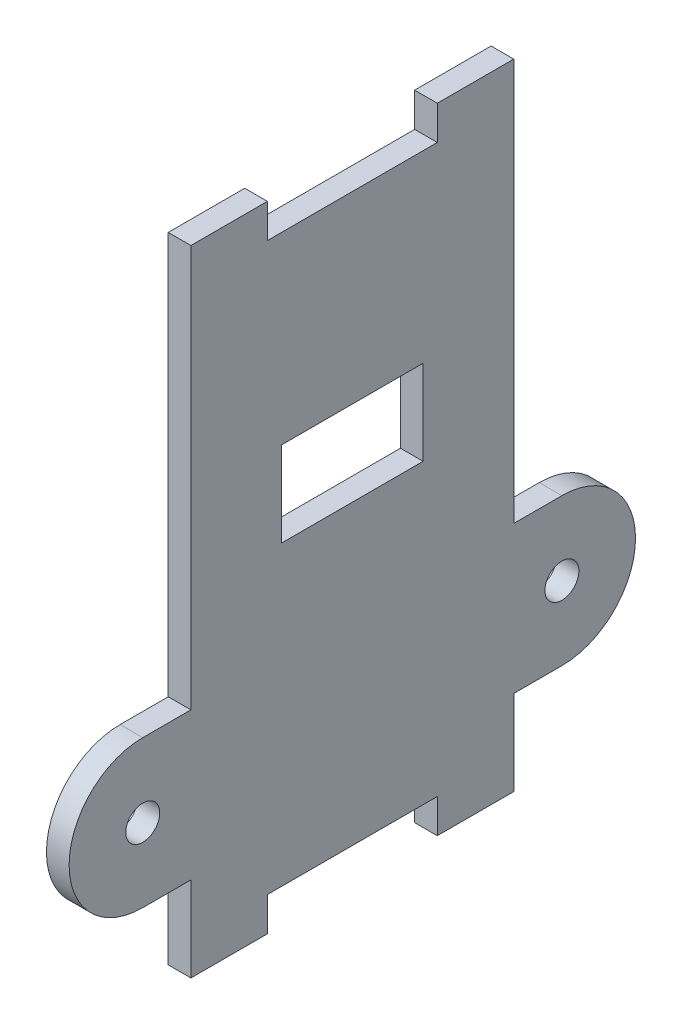
ISO-10303-21;
HEADER;
FILE_DESCRIPTION(('STEP AP214'),'2;1');
FILE_NAME('part.step','',(''),(''),'','','');
FILE_SCHEMA(('AUTOMOTIVE_DESIGN { 1 0 10303 214 1 1 1 1 }'));
ENDSEC;
DATA;
#1=APPLICATION_CONTEXT('core data for automotive mechanical design processes');
#2=APPLICATION_PROTOCOL_DEFINITION('international standard','automotive_design',2000,#1);
#3=PRODUCT_CONTEXT('',#1,'mechanical');
#4=PRODUCT('Part','Part','',(#3));
#5=PRODUCT_RELATED_PRODUCT_CATEGORY('part','',(#4));
#6=PRODUCT_DEFINITION_FORMATION('','',#4);
#7=PRODUCT_DEFINITION_CONTEXT('part definition',#1,'design');
#8=PRODUCT_DEFINITION('design','',#6,#7);
#9=PRODUCT_DEFINITION_SHAPE('','',#8);
#10=(LENGTH_UNIT() NAMED_UNIT(*) SI_UNIT(.MILLI.,.METRE.));
#11=(NAMED_UNIT(*) PLANE_ANGLE_UNIT() SI_UNIT($,.RADIAN.));
#12=(NAMED_UNIT(*) SI_UNIT($,.STERADIAN.) SOLID_ANGLE_UNIT());
#13=UNCERTAINTY_MEASURE_WITH_UNIT(LENGTH_MEASURE(1.E-05),#10,'distance_accuracy_value','');
#14=(GEOMETRIC_REPRESENTATION_CONTEXT(3) GLOBAL_UNCERTAINTY_ASSIGNED_CONTEXT((#13)) GLOBAL_UNIT_ASSIGNED_CONTEXT((#10,
#11,#12)) REPRESENTATION_CONTEXT('',''));
#15=CARTESIAN_POINT('',(0.,0.,0.));
#16=DIRECTION('',(0.,0.,1.));
#17=DIRECTION('',(1.,0.,0.));
#18=AXIS2_PLACEMENT_3D('',#15,#16,#17);
#19=CARTESIAN_POINT('',(0.,-14.,-18.5));
#20=DIRECTION('',(1.,0.,0.));
#21=DIRECTION('',(0.,0.,-1.));
#22=AXIS2_PLACEMENT_3D('',#19,#20,#21);
#23=PLANE('',#22);
#24=DIRECTION('',(0.,0.,-1.));
#25=VECTOR('',#24,1.);
#26=CARTESIAN_POINT('',(0.,8.75,6.25));
#27=LINE('',#26,#25);
#28=CARTESIAN_POINT('',(0.,8.75,6.25));
#29=VERTEX_POINT('',#28);
#30=CARTESIAN_POINT('',(0.,8.75,-6.25));
#31=VERTEX_POINT('',#30);
#32=EDGE_CURVE('E316',#29,#31,#27,.T.);
#33=ORIENTED_EDGE('',*,*,#32,.F.);
#34=DIRECTION('',(0.,1.,0.));
#35=VECTOR('',#34,1.);
#36=CARTESIAN_POINT('',(0.,1.25,6.25));
#37=LINE('',#36,#35);
#38=CARTESIAN_POINT('',(0.,1.25,6.25));
#39=VERTEX_POINT('',#38);
#40=EDGE_CURVE('E407',#39,#29,#37,.T.);
#41=ORIENTED_EDGE('',*,*,#40,.F.);
#42=DIRECTION('',(0.,0.,1.));
#43=VECTOR('',#42,1.);
#44=CARTESIAN_POINT('',(0.,1.25,6.25));
#45=LINE('',#44,#43);
#46=CARTESIAN_POINT('',(0.,1.25,-6.25));
#47=VERTEX_POINT('',#46);
#48=EDGE_CURVE('E413',#47,#39,#45,.T.);
#49=ORIENTED_EDGE('',*,*,#48,.F.);
#50=DIRECTION('',(0.,1.,0.));
#51=VECTOR('',#50,1.);
#52=CARTESIAN_POINT('',(0.,1.25,-6.25));
#53=LINE('',#52,#51);
#54=EDGE_CURVE('E418',#31,#47,#53,.F.);
#55=ORIENTED_EDGE('',*,*,#54,.F.);
#56=EDGE_LOOP('',(#33,#41,#49,#55));
#57=FACE_BOUND('',#56,.T.);
#58=CARTESIAN_POINT('',(0.,-14.,-18.5));
#59=DIRECTION('',(-1.,0.,0.));
#60=DIRECTION('',(0.,0.,1.));
#61=AXIS2_PLACEMENT_3D('',#58,#59,#60);
#62=CIRCLE('',#61,1.5);
#63=CARTESIAN_POINT('',(0.,-14.,-17.));
#64=VERTEX_POINT('',#63);
#65=EDGE_CURVE('E237',#64,#64,#62,.F.);
#66=ORIENTED_EDGE('',*,*,#65,.T.);
#67=EDGE_LOOP('',(#66));
#68=FACE_BOUND('',#67,.T.);
#69=DIRECTION('',(0.,-1.,0.));
#70=VECTOR('',#69,1.);
#71=CARTESIAN_POINT('',(0.,-25.,-14.25));
#72=LINE('',#71,#70);
#73=CARTESIAN_POINT('',(0.,-20.5,-14.25));
#74=VERTEX_POINT('',#73);
#75=CARTESIAN_POINT('',(0.,-28.,-14.25));
#76=VERTEX_POINT('',#75);
#77=EDGE_CURVE('E208',#74,#76,#72,.T.);
#78=ORIENTED_EDGE('',*,*,#77,.T.);
#79=DIRECTION('',(0.,0.,1.));
#80=VECTOR('',#79,1.);
#81=CARTESIAN_POINT('',(0.,-28.,-14.25));
#82=LINE('',#81,#80);
#83=CARTESIAN_POINT('',(0.,-28.,-7.5));
#84=VERTEX_POINT('',#83);
#85=EDGE_CURVE('E221',#76,#84,#82,.T.);
#86=ORIENTED_EDGE('',*,*,#85,.T.);
#87=DIRECTION('',(0.,1.,0.));
#88=VECTOR('',#87,1.);
#89=CARTESIAN_POINT('',(0.,-25.,-7.5));
#90=LINE('',#89,#88);
#91=CARTESIAN_POINT('',(0.,-25.,-7.5));
#92=VERTEX_POINT('',#91);
#93=EDGE_CURVE('E424',#84,#92,#90,.T.);
#94=ORIENTED_EDGE('',*,*,#93,.T.);
#95=DIRECTION('',(0.,0.,1.));
#96=VECTOR('',#95,1.);
#97=CARTESIAN_POINT('',(0.,-25.,0.));
#98=LINE('',#97,#96);
#99=CARTESIAN_POINT('',(0.,-25.,7.5));
#100=VERTEX_POINT('',#99);
#101=EDGE_CURVE('E429',#92,#100,#98,.T.);
#102=ORIENTED_EDGE('',*,*,#101,.T.);
#103=DIRECTION('',(0.,-1.,0.));
#104=VECTOR('',#103,1.);
#105=CARTESIAN_POINT('',(0.,-25.,7.5));
#106=LINE('',#105,#104);
#107=CARTESIAN_POINT('',(0.,-28.,7.5));
#108=VERTEX_POINT('',#107);
#109=EDGE_CURVE('E434',#100,#108,#106,.T.);
#110=ORIENTED_EDGE('',*,*,#109,.T.);
#111=DIRECTION('',(0.,0.,1.));
#112=VECTOR('',#111,1.);
#113=CARTESIAN_POINT('',(0.,-28.,14.25));
#114=LINE('',#113,#112);
#115=CARTESIAN_POINT('',(0.,-28.,14.25));
#116=VERTEX_POINT('',#115);
#117=EDGE_CURVE('E439',#108,#116,#114,.T.);
#118=ORIENTED_EDGE('',*,*,#117,.T.);
#119=DIRECTION('',(0.,1.,0.));
#120=VECTOR('',#119,1.);
#121=CARTESIAN_POINT('',(0.,-25.,14.25));
#122=LINE('',#121,#120);
#123=CARTESIAN_POINT('',(0.,-20.5,14.25));
#124=VERTEX_POINT('',#123);
#125=EDGE_CURVE('E247',#116,#124,#122,.T.);
#126=ORIENTED_EDGE('',*,*,#125,.T.);
#127=DIRECTION('',(0.,0.,1.));
#128=VECTOR('',#127,1.);
#129=CARTESIAN_POINT('',(0.,-20.5,18.5));
#130=LINE('',#129,#128);
#131=CARTESIAN_POINT('',(0.,-20.5,18.5));
#132=VERTEX_POINT('',#131);
#133=EDGE_CURVE('E240',#124,#132,#130,.T.);
#134=ORIENTED_EDGE('',*,*,#133,.T.);
#135=CARTESIAN_POINT('',(0.,-14.,18.5));
#136=DIRECTION('',(-1.,0.,0.));
#137=DIRECTION('',(0.,0.,1.));
#138=AXIS2_PLACEMENT_3D('',#135,#136,#137);
#139=CIRCLE('',#138,6.5);
#140=CARTESIAN_POINT('',(0.,-7.50000000000001,18.5));
#141=VERTEX_POINT('',#140);
#142=EDGE_CURVE('E317',#141,#132,#139,.F.);
#143=ORIENTED_EDGE('',*,*,#142,.F.);
#144=DIRECTION('',(0.,0.,-1.));
#145=VECTOR('',#144,1.);
#146=CARTESIAN_POINT('',(0.,-7.50000000000001,18.5));
#147=LINE('',#146,#145);
#148=CARTESIAN_POINT('',(0.,-7.50000000000001,14.25));
#149=VERTEX_POINT('',#148);
#150=EDGE_CURVE('E253',#141,#149,#147,.T.);
#151=ORIENTED_EDGE('',*,*,#150,.T.);
#152=DIRECTION('',(0.,1.,0.));
#153=VECTOR('',#152,1.);
#154=CARTESIAN_POINT('',(0.,-7.50000000000001,14.25));
#155=LINE('',#154,#153);
#156=CARTESIAN_POINT('',(0.,28.,14.25));
#157=VERTEX_POINT('',#156);
#158=EDGE_CURVE('E260',#149,#157,#155,.T.);
#159=ORIENTED_EDGE('',*,*,#158,.T.);
#160=DIRECTION('',(0.,0.,-1.));
#161=VECTOR('',#160,1.);
#162=CARTESIAN_POINT('',(0.,28.,14.25));
#163=LINE('',#162,#161);
#164=CARTESIAN_POINT('',(0.,28.,7.5));
#165=VERTEX_POINT('',#164);
#166=EDGE_CURVE('E266',#157,#165,#163,.T.);
#167=ORIENTED_EDGE('',*,*,#166,.T.);
#168=DIRECTION('',(0.,1.,0.));
#169=VECTOR('',#168,1.);
#170=CARTESIAN_POINT('',(0.,25.,7.5));
#171=LINE('',#170,#169);
#172=CARTESIAN_POINT('',(0.,25.,7.5));
#173=VERTEX_POINT('',#172);
#174=EDGE_CURVE('E272',#165,#173,#171,.F.);
#175=ORIENTED_EDGE('',*,*,#174,.T.);
#176=DIRECTION('',(0.,0.,-1.));
#177=VECTOR('',#176,1.);
#178=CARTESIAN_POINT('',(0.,25.,0.));
#179=LINE('',#178,#177);
#180=CARTESIAN_POINT('',(0.,25.,-7.5));
#181=VERTEX_POINT('',#180);
#182=EDGE_CURVE('E278',#173,#181,#179,.T.);
#183=ORIENTED_EDGE('',*,*,#182,.T.);
#184=DIRECTION('',(0.,1.,0.));
#185=VECTOR('',#184,1.);
#186=CARTESIAN_POINT('',(0.,25.,-7.5));
#187=LINE('',#186,#185);
#188=CARTESIAN_POINT('',(0.,28.,-7.5));
#189=VERTEX_POINT('',#188);
#190=EDGE_CURVE('E284',#181,#189,#187,.T.);
#191=ORIENTED_EDGE('',*,*,#190,.T.);
#192=DIRECTION('',(0.,0.,-1.));
#193=VECTOR('',#192,1.);
#194=CARTESIAN_POINT('',(0.,28.,-14.25));
#195=LINE('',#194,#193);
#196=CARTESIAN_POINT('',(0.,28.,-14.25));
#197=VERTEX_POINT('',#196);
#198=EDGE_CURVE('E290',#189,#197,#195,.T.);
#199=ORIENTED_EDGE('',*,*,#198,.T.);
#200=DIRECTION('',(0.,1.,0.));
#201=VECTOR('',#200,1.);
#202=CARTESIAN_POINT('',(0.,25.,-14.25));
#203=LINE('',#202,#201);
#204=CARTESIAN_POINT('',(0.,-7.5,-14.25));
#205=VERTEX_POINT('',#204);
#206=EDGE_CURVE('E191',#197,#205,#203,.F.);
#207=ORIENTED_EDGE('',*,*,#206,.T.);
#208=DIRECTION('',(0.,0.,-1.));
#209=VECTOR('',#208,1.);
#210=CARTESIAN_POINT('',(0.,-7.5,-18.5));
#211=LINE('',#210,#209);
#212=CARTESIAN_POINT('',(0.,-7.5,-18.5));
#213=VERTEX_POINT('',#212);
#214=EDGE_CURVE('E188',#205,#213,#211,.T.);
#215=ORIENTED_EDGE('',*,*,#214,.T.);
#216=CARTESIAN_POINT('',(0.,-14.,-18.5));
#217=DIRECTION('',(-1.,0.,0.));
#218=DIRECTION('',(0.,0.,1.));
#219=AXIS2_PLACEMENT_3D('',#216,#217,#218);
#220=CIRCLE('',#219,6.5);
#221=CARTESIAN_POINT('',(0.,-20.5,-18.5));
#222=VERTEX_POINT('',#221);
#223=EDGE_CURVE('E176',#222,#213,#220,.F.);
#224=ORIENTED_EDGE('',*,*,#223,.F.);
#225=DIRECTION('',(0.,0.,1.));
#226=VECTOR('',#225,1.);
#227=CARTESIAN_POINT('',(0.,-20.5,-14.25));
#228=LINE('',#227,#226);
#229=EDGE_CURVE('E186',#222,#74,#228,.T.);
#230=ORIENTED_EDGE('',*,*,#229,.T.);
#231=EDGE_LOOP('',(#78,#86,#94,#102,#110,#118,#126,#134,#143,#151,#159,#167,#175,#183,#191,#199,
#207,#215,#224,#230));
#232=FACE_BOUND('',#231,.T.);
#233=CARTESIAN_POINT('',(0.,-14.,18.5));
#234=DIRECTION('',(-1.,0.,0.));
#235=DIRECTION('',(0.,0.,1.));
#236=AXIS2_PLACEMENT_3D('',#233,#234,#235);
#237=CIRCLE('',#236,1.5);
#238=CARTESIAN_POINT('',(0.,-14.,20.));
#239=VERTEX_POINT('',#238);
#240=EDGE_CURVE('E19',#239,#239,#237,.F.);
#241=ORIENTED_EDGE('',*,*,#240,.T.);
#242=EDGE_LOOP('',(#241));
#243=FACE_BOUND('',#242,.T.);
#244=ADVANCED_FACE('F16',(#57,#68,#232,#243),#23,.F.);
#245=CARTESIAN_POINT('',(2.,-14.,18.5));
#246=DIRECTION('',(-1.,0.,0.));
#247=DIRECTION('',(0.,0.,1.));
#248=AXIS2_PLACEMENT_3D('',#245,#246,#247);
#249=CYLINDRICAL_SURFACE('',#248,1.5);
#250=CARTESIAN_POINT('',(2.,-14.,18.5));
#251=DIRECTION('',(-1.,0.,0.));
#252=DIRECTION('',(0.,0.,1.));
#253=AXIS2_PLACEMENT_3D('',#250,#251,#252);
#254=CIRCLE('',#253,1.5);
#255=CARTESIAN_POINT('',(2.,-14.,20.));
#256=VERTEX_POINT('',#255);
#257=EDGE_CURVE('E215',#256,#256,#254,.T.);
#258=ORIENTED_EDGE('',*,*,#257,.F.);
#259=EDGE_LOOP('',(#258));
#260=FACE_BOUND('',#259,.T.);
#261=ORIENTED_EDGE('',*,*,#240,.F.);
#262=EDGE_LOOP('',(#261));
#263=FACE_BOUND('',#262,.T.);
#264=ADVANCED_FACE('F713',(#260,#263),#249,.F.);
#265=CARTESIAN_POINT('',(2.,-25.,-14.25));
#266=DIRECTION('',(0.,0.,1.));
#267=DIRECTION('',(0.,-1.,0.));
#268=AXIS2_PLACEMENT_3D('',#265,#266,#267);
#269=PLANE('',#268);
#270=DIRECTION('',(1.,0.,0.));
#271=VECTOR('',#270,1.);
#272=CARTESIAN_POINT('',(2.,-20.5,-14.25));
#273=LINE('',#272,#271);
#274=CARTESIAN_POINT('',(2.,-20.5,-14.25));
#275=VERTEX_POINT('',#274);
#276=EDGE_CURVE('E206',#74,#275,#273,.T.);
#277=ORIENTED_EDGE('',*,*,#276,.T.);
#278=DIRECTION('',(0.,1.,0.));
#279=VECTOR('',#278,1.);
#280=CARTESIAN_POINT('',(2.,-14.,-14.25));
#281=LINE('',#280,#279);
#282=CARTESIAN_POINT('',(2.,-28.,-14.25));
#283=VERTEX_POINT('',#282);
#284=EDGE_CURVE('E211',#283,#275,#281,.T.);
#285=ORIENTED_EDGE('',*,*,#284,.F.);
#286=DIRECTION('',(1.,0.,0.));
#287=VECTOR('',#286,1.);
#288=CARTESIAN_POINT('',(2.,-28.,-14.25));
#289=LINE('',#288,#287);
#290=EDGE_CURVE('E218',#283,#76,#289,.F.);
#291=ORIENTED_EDGE('',*,*,#290,.T.);
#292=ORIENTED_EDGE('',*,*,#77,.F.);
#293=EDGE_LOOP('',(#277,#285,#291,#292));
#294=FACE_BOUND('',#293,.T.);
#295=ADVANCED_FACE('F704',(#294),#269,.F.);
#296=CARTESIAN_POINT('',(2.,-20.5,-14.25));
#297=DIRECTION('',(0.,1.,0.));
#298=DIRECTION('',(0.,0.,1.));
#299=AXIS2_PLACEMENT_3D('',#296,#297,#298);
#300=PLANE('',#299);
#301=DIRECTION('',(-1.,0.,0.));
#302=VECTOR('',#301,1.);
#303=CARTESIAN_POINT('',(2.,-20.5,-18.5));
#304=LINE('',#303,#302);
#305=CARTESIAN_POINT('',(2.,-20.5,-18.5));
#306=VERTEX_POINT('',#305);
#307=EDGE_CURVE('E185',#306,#222,#304,.T.);
#308=ORIENTED_EDGE('',*,*,#307,.F.);
#309=DIRECTION('',(0.,0.,-1.));
#310=VECTOR('',#309,1.);
#311=CARTESIAN_POINT('',(2.,-20.5,-18.5));
#312=LINE('',#311,#310);
#313=EDGE_CURVE('E214',#275,#306,#312,.T.);
#314=ORIENTED_EDGE('',*,*,#313,.F.);
#315=ORIENTED_EDGE('',*,*,#276,.F.);
#316=ORIENTED_EDGE('',*,*,#229,.F.);
#317=EDGE_LOOP('',(#308,#314,#315,#316));
#318=FACE_BOUND('',#317,.T.);
#319=ADVANCED_FACE('F696',(#318),#300,.F.);
#320=CARTESIAN_POINT('',(2.,-14.,-18.5));
#321=DIRECTION('',(-1.,0.,0.));
#322=DIRECTION('',(0.,0.,1.));
#323=AXIS2_PLACEMENT_3D('',#320,#321,#322);
#324=CYLINDRICAL_SURFACE('',#323,6.5);
#325=CARTESIAN_POINT('',(2.,-14.,-18.5));
#326=DIRECTION('',(-1.,0.,0.));
#327=DIRECTION('',(0.,0.,1.));
#328=AXIS2_PLACEMENT_3D('',#325,#326,#327);
#329=CIRCLE('',#328,6.5);
#330=CARTESIAN_POINT('',(2.,-7.5,-18.5));
#331=VERTEX_POINT('',#330);
#332=EDGE_CURVE('E310',#306,#331,#329,.F.);
#333=ORIENTED_EDGE('',*,*,#332,.F.);
#334=ORIENTED_EDGE('',*,*,#307,.T.);
#335=ORIENTED_EDGE('',*,*,#223,.T.);
#336=DIRECTION('',(1.,0.,0.));
#337=VECTOR('',#336,1.);
#338=CARTESIAN_POINT('',(2.,-7.5,-18.5));
#339=LINE('',#338,#337);
#340=EDGE_CURVE('E183',#213,#331,#339,.T.);
#341=ORIENTED_EDGE('',*,*,#340,.T.);
#342=EDGE_LOOP('',(#333,#334,#335,#341));
#343=FACE_BOUND('',#342,.T.);
#344=ADVANCED_FACE('F181',(#343),#324,.T.);
#345=CARTESIAN_POINT('',(2.,-7.5,-18.5));
#346=DIRECTION('',(0.,-1.,0.));
#347=DIRECTION('',(0.,0.,-1.));
#348=AXIS2_PLACEMENT_3D('',#345,#346,#347);
#349=PLANE('',#348);
#350=DIRECTION('',(1.,0.,0.));
#351=VECTOR('',#350,1.);
#352=CARTESIAN_POINT('',(2.,-7.5,-14.25));
#353=LINE('',#352,#351);
#354=CARTESIAN_POINT('',(2.,-7.5,-14.25));
#355=VERTEX_POINT('',#354);
#356=EDGE_CURVE('E194',#205,#355,#353,.T.);
#357=ORIENTED_EDGE('',*,*,#356,.T.);
#358=DIRECTION('',(0.,0.,-1.));
#359=VECTOR('',#358,1.);
#360=CARTESIAN_POINT('',(2.,-7.5,-18.5));
#361=LINE('',#360,#359);
#362=EDGE_CURVE('E198',#331,#355,#361,.F.);
#363=ORIENTED_EDGE('',*,*,#362,.F.);
#364=ORIENTED_EDGE('',*,*,#340,.F.);
#365=ORIENTED_EDGE('',*,*,#214,.F.);
#366=EDGE_LOOP('',(#357,#363,#364,#365));
#367=FACE_BOUND('',#366,.T.);
#368=ADVANCED_FACE('F196',(#367),#349,.F.);
#369=CARTESIAN_POINT('',(2.,25.,-14.25));
#370=DIRECTION('',(0.,0.,1.));
#371=DIRECTION('',(1.,0.,0.));
#372=AXIS2_PLACEMENT_3D('',#369,#370,#371);
#373=PLANE('',#372);
#374=DIRECTION('',(1.,0.,0.));
#375=VECTOR('',#374,1.);
#376=CARTESIAN_POINT('',(2.,28.,-14.25));
#377=LINE('',#376,#375);
#378=CARTESIAN_POINT('',(2.,28.,-14.25));
#379=VERTEX_POINT('',#378);
#380=EDGE_CURVE('E292',#197,#379,#377,.T.);
#381=ORIENTED_EDGE('',*,*,#380,.T.);
#382=DIRECTION('',(0.,1.,0.));
#383=VECTOR('',#382,1.);
#384=CARTESIAN_POINT('',(2.,-14.,-14.25));
#385=LINE('',#384,#383);
#386=EDGE_CURVE('E374',#355,#379,#385,.T.);
#387=ORIENTED_EDGE('',*,*,#386,.F.);
#388=ORIENTED_EDGE('',*,*,#356,.F.);
#389=ORIENTED_EDGE('',*,*,#206,.F.);
#390=EDGE_LOOP('',(#381,#387,#388,#389));
#391=FACE_BOUND('',#390,.T.);
#392=ADVANCED_FACE('F385',(#391),#373,.F.);
#393=CARTESIAN_POINT('',(2.,28.,-14.25));
#394=DIRECTION('',(0.,-1.,0.));
#395=DIRECTION('',(0.,0.,-1.));
#396=AXIS2_PLACEMENT_3D('',#393,#394,#395);
#397=PLANE('',#396);
#398=DIRECTION('',(-1.,0.,0.));
#399=VECTOR('',#398,1.);
#400=CARTESIAN_POINT('',(2.,28.,-7.5));
#401=LINE('',#400,#399);
#402=CARTESIAN_POINT('',(2.,28.,-7.5));
#403=VERTEX_POINT('',#402);
#404=EDGE_CURVE('E287',#189,#403,#401,.F.);
#405=ORIENTED_EDGE('',*,*,#404,.T.);
#406=DIRECTION('',(0.,0.,-1.));
#407=VECTOR('',#406,1.);
#408=CARTESIAN_POINT('',(2.,28.,-18.5));
#409=LINE('',#408,#407);
#410=EDGE_CURVE('E366',#379,#403,#409,.F.);
#411=ORIENTED_EDGE('',*,*,#410,.F.);
#412=ORIENTED_EDGE('',*,*,#380,.F.);
#413=ORIENTED_EDGE('',*,*,#198,.F.);
#414=EDGE_LOOP('',(#405,#411,#412,#413));
#415=FACE_BOUND('',#414,.T.);
#416=ADVANCED_FACE('F665',(#415),#397,.F.);
#417=CARTESIAN_POINT('',(2.,25.,-7.5));
#418=DIRECTION('',(0.,0.,-1.));
#419=DIRECTION('',(-1.,0.,0.));
#420=AXIS2_PLACEMENT_3D('',#417,#418,#419);
#421=PLANE('',#420);
#422=DIRECTION('',(1.,0.,0.));
#423=VECTOR('',#422,1.);
#424=CARTESIAN_POINT('',(2.,25.,-7.50000000000001));
#425=LINE('',#424,#423);
#426=CARTESIAN_POINT('',(2.,25.,-7.5));
#427=VERTEX_POINT('',#426);
#428=EDGE_CURVE('E281',#181,#427,#425,.T.);
#429=ORIENTED_EDGE('',*,*,#428,.T.);
#430=DIRECTION('',(0.,1.,0.));
#431=VECTOR('',#430,1.);
#432=CARTESIAN_POINT('',(2.,-14.,-7.5));
#433=LINE('',#432,#431);
#434=EDGE_CURVE('E358',#403,#427,#433,.F.);
#435=ORIENTED_EDGE('',*,*,#434,.F.);
#436=ORIENTED_EDGE('',*,*,#404,.F.);
#437=ORIENTED_EDGE('',*,*,#190,.F.);
#438=EDGE_LOOP('',(#429,#435,#436,#437));
#439=FACE_BOUND('',#438,.T.);
#440=ADVANCED_FACE('F656',(#439),#421,.F.);
#441=CARTESIAN_POINT('',(2.,25.,0.));
#442=DIRECTION('',(0.,-1.,0.));
#443=DIRECTION('',(0.,0.,-1.));
#444=AXIS2_PLACEMENT_3D('',#441,#442,#443);
#445=PLANE('',#444);
#446=DIRECTION('',(1.,0.,0.));
#447=VECTOR('',#446,1.);
#448=CARTESIAN_POINT('',(2.,25.,7.5));
#449=LINE('',#448,#447);
#450=CARTESIAN_POINT('',(2.,25.,7.5));
#451=VERTEX_POINT('',#450);
#452=EDGE_CURVE('E275',#173,#451,#449,.T.);
#453=ORIENTED_EDGE('',*,*,#452,.T.);
#454=DIRECTION('',(0.,0.,-1.));
#455=VECTOR('',#454,1.);
#456=CARTESIAN_POINT('',(2.,25.,-18.5));
#457=LINE('',#456,#455);
#458=EDGE_CURVE('E350',#427,#451,#457,.F.);
#459=ORIENTED_EDGE('',*,*,#458,.F.);
#460=ORIENTED_EDGE('',*,*,#428,.F.);
#461=ORIENTED_EDGE('',*,*,#182,.F.);
#462=EDGE_LOOP('',(#453,#459,#460,#461));
#463=FACE_BOUND('',#462,.T.);
#464=ADVANCED_FACE('F647',(#463),#445,.F.);
#465=CARTESIAN_POINT('',(2.,25.,7.5));
#466=DIRECTION('',(0.,0.,1.));
#467=DIRECTION('',(1.,0.,0.));
#468=AXIS2_PLACEMENT_3D('',#465,#466,#467);
#469=PLANE('',#468);
#470=DIRECTION('',(1.,0.,0.));
#471=VECTOR('',#470,1.);
#472=CARTESIAN_POINT('',(2.,28.,7.5));
#473=LINE('',#472,#471);
#474=CARTESIAN_POINT('',(2.,28.,7.5));
#475=VERTEX_POINT('',#474);
#476=EDGE_CURVE('E269',#165,#475,#473,.T.);
#477=ORIENTED_EDGE('',*,*,#476,.T.);
#478=DIRECTION('',(0.,1.,0.));
#479=VECTOR('',#478,1.);
#480=CARTESIAN_POINT('',(2.,-14.,7.5));
#481=LINE('',#480,#479);
#482=EDGE_CURVE('E342',#451,#475,#481,.T.);
#483=ORIENTED_EDGE('',*,*,#482,.F.);
#484=ORIENTED_EDGE('',*,*,#452,.F.);
#485=ORIENTED_EDGE('',*,*,#174,.F.);
#486=EDGE_LOOP('',(#477,#483,#484,#485));
#487=FACE_BOUND('',#486,.T.);
#488=ADVANCED_FACE('F638',(#487),#469,.F.);
#489=CARTESIAN_POINT('',(2.,28.,14.25));
#490=DIRECTION('',(0.,-1.,0.));
#491=DIRECTION('',(0.,0.,-1.));
#492=AXIS2_PLACEMENT_3D('',#489,#490,#491);
#493=PLANE('',#492);
#494=DIRECTION('',(1.,0.,0.));
#495=VECTOR('',#494,1.);
#496=CARTESIAN_POINT('',(2.,28.,14.25));
#497=LINE('',#496,#495);
#498=CARTESIAN_POINT('',(2.,28.,14.25));
#499=VERTEX_POINT('',#498);
#500=EDGE_CURVE('E263',#157,#499,#497,.T.);
#501=ORIENTED_EDGE('',*,*,#500,.T.);
#502=DIRECTION('',(0.,0.,-1.));
#503=VECTOR('',#502,1.);
#504=CARTESIAN_POINT('',(2.,28.,-18.5));
#505=LINE('',#504,#503);
#506=EDGE_CURVE('E334',#475,#499,#505,.F.);
#507=ORIENTED_EDGE('',*,*,#506,.F.);
#508=ORIENTED_EDGE('',*,*,#476,.F.);
#509=ORIENTED_EDGE('',*,*,#166,.F.);
#510=EDGE_LOOP('',(#501,#507,#508,#509));
#511=FACE_BOUND('',#510,.T.);
#512=ADVANCED_FACE('F629',(#511),#493,.F.);
#513=CARTESIAN_POINT('',(2.,-7.50000000000001,14.25));
#514=DIRECTION('',(0.,0.,-1.));
#515=DIRECTION('',(0.,1.,0.));
#516=AXIS2_PLACEMENT_3D('',#513,#514,#515);
#517=PLANE('',#516);
#518=DIRECTION('',(1.,0.,0.));
#519=VECTOR('',#518,1.);
#520=CARTESIAN_POINT('',(2.,-7.50000000000001,14.25));
#521=LINE('',#520,#519);
#522=CARTESIAN_POINT('',(2.,-7.50000000000001,14.25));
#523=VERTEX_POINT('',#522);
#524=EDGE_CURVE('E257',#149,#523,#521,.T.);
#525=ORIENTED_EDGE('',*,*,#524,.T.);
#526=DIRECTION('',(0.,1.,0.));
#527=VECTOR('',#526,1.);
#528=CARTESIAN_POINT('',(2.,-14.,14.25));
#529=LINE('',#528,#527);
#530=EDGE_CURVE('E331',#499,#523,#529,.F.);
#531=ORIENTED_EDGE('',*,*,#530,.F.);
#532=ORIENTED_EDGE('',*,*,#500,.F.);
#533=ORIENTED_EDGE('',*,*,#158,.F.);
#534=EDGE_LOOP('',(#525,#531,#532,#533));
#535=FACE_BOUND('',#534,.T.);
#536=ADVANCED_FACE('F481',(#535),#517,.F.);
#537=CARTESIAN_POINT('',(2.,-7.50000000000001,18.5));
#538=DIRECTION('',(0.,-1.,0.));
#539=DIRECTION('',(0.,0.,-1.));
#540=AXIS2_PLACEMENT_3D('',#537,#538,#539);
#541=PLANE('',#540);
#542=DIRECTION('',(-1.,0.,0.));
#543=VECTOR('',#542,1.);
#544=CARTESIAN_POINT('',(2.,-7.50000000000001,18.5));
#545=LINE('',#544,#543);
#546=CARTESIAN_POINT('',(2.,-7.50000000000001,18.5));
#547=VERTEX_POINT('',#546);
#548=EDGE_CURVE('E256',#547,#141,#545,.T.);
#549=ORIENTED_EDGE('',*,*,#548,.F.);
#550=DIRECTION('',(0.,0.,-1.));
#551=VECTOR('',#550,1.);
#552=CARTESIAN_POINT('',(2.,-7.50000000000001,-18.5));
#553=LINE('',#552,#551);
#554=EDGE_CURVE('E309',#523,#547,#553,.F.);
#555=ORIENTED_EDGE('',*,*,#554,.F.);
#556=ORIENTED_EDGE('',*,*,#524,.F.);
#557=ORIENTED_EDGE('',*,*,#150,.F.);
#558=EDGE_LOOP('',(#549,#555,#556,#557));
#559=FACE_BOUND('',#558,.T.);
#560=ADVANCED_FACE('F470',(#559),#541,.F.);
#561=CARTESIAN_POINT('',(2.,-14.,18.5));
#562=DIRECTION('',(-1.,0.,0.));
#563=DIRECTION('',(0.,0.,1.));
#564=AXIS2_PLACEMENT_3D('',#561,#562,#563);
#565=CYLINDRICAL_SURFACE('',#564,6.5);
#566=ORIENTED_EDGE('',*,*,#142,.T.);
#567=DIRECTION('',(1.,0.,0.));
#568=VECTOR('',#567,1.);
#569=CARTESIAN_POINT('',(2.,-20.5,18.5));
#570=LINE('',#569,#568);
#571=CARTESIAN_POINT('',(2.,-20.5,18.5));
#572=VERTEX_POINT('',#571);
#573=EDGE_CURVE('E244',#132,#572,#570,.T.);
#574=ORIENTED_EDGE('',*,*,#573,.T.);
#575=CARTESIAN_POINT('',(2.,-14.,18.5));
#576=DIRECTION('',(-1.,0.,0.));
#577=DIRECTION('',(0.,0.,1.));
#578=AXIS2_PLACEMENT_3D('',#575,#576,#577);
#579=CIRCLE('',#578,6.5);
#580=EDGE_CURVE('E306',#547,#572,#579,.F.);
#581=ORIENTED_EDGE('',*,*,#580,.F.);
#582=ORIENTED_EDGE('',*,*,#548,.T.);
#583=EDGE_LOOP('',(#566,#574,#581,#582));
#584=FACE_BOUND('',#583,.T.);
#585=ADVANCED_FACE('F472',(#584),#565,.T.);
#586=CARTESIAN_POINT('',(2.,-20.5,18.5));
#587=DIRECTION('',(0.,1.,0.));
#588=DIRECTION('',(0.,0.,1.));
#589=AXIS2_PLACEMENT_3D('',#586,#587,#588);
#590=PLANE('',#589);
#591=DIRECTION('',(1.,0.,0.));
#592=VECTOR('',#591,1.);
#593=CARTESIAN_POINT('',(2.,-20.5,14.25));
#594=LINE('',#593,#592);
#595=CARTESIAN_POINT('',(2.,-20.5,14.25));
#596=VERTEX_POINT('',#595);
#597=EDGE_CURVE('E243',#124,#596,#594,.T.);
#598=ORIENTED_EDGE('',*,*,#597,.T.);
#599=DIRECTION('',(0.,0.,-1.));
#600=VECTOR('',#599,1.);
#601=CARTESIAN_POINT('',(2.,-20.5,-18.5));
#602=LINE('',#601,#600);
#603=EDGE_CURVE('E308',#572,#596,#602,.T.);
#604=ORIENTED_EDGE('',*,*,#603,.F.);
#605=ORIENTED_EDGE('',*,*,#573,.F.);
#606=ORIENTED_EDGE('',*,*,#133,.F.);
#607=EDGE_LOOP('',(#598,#604,#605,#606));
#608=FACE_BOUND('',#607,.T.);
#609=ADVANCED_FACE('F452',(#608),#590,.F.);
#610=CARTESIAN_POINT('',(2.,-25.,14.25));
#611=DIRECTION('',(0.,0.,-1.));
#612=DIRECTION('',(0.,1.,0.));
#613=AXIS2_PLACEMENT_3D('',#610,#611,#612);
#614=PLANE('',#613);
#615=DIRECTION('',(1.,0.,0.));
#616=VECTOR('',#615,1.);
#617=CARTESIAN_POINT('',(2.,-28.,14.25));
#618=LINE('',#617,#616);
#619=CARTESIAN_POINT('',(2.,-28.,14.25));
#620=VERTEX_POINT('',#619);
#621=EDGE_CURVE('E250',#116,#620,#618,.T.);
#622=ORIENTED_EDGE('',*,*,#621,.T.);
#623=DIRECTION('',(0.,1.,0.));
#624=VECTOR('',#623,1.);
#625=CARTESIAN_POINT('',(2.,-14.,14.25));
#626=LINE('',#625,#624);
#627=EDGE_CURVE('E443',#596,#620,#626,.F.);
#628=ORIENTED_EDGE('',*,*,#627,.F.);
#629=ORIENTED_EDGE('',*,*,#597,.F.);
#630=ORIENTED_EDGE('',*,*,#125,.F.);
#631=EDGE_LOOP('',(#622,#628,#629,#630));
#632=FACE_BOUND('',#631,.T.);
#633=ADVANCED_FACE('F456',(#632),#614,.F.);
#634=CARTESIAN_POINT('',(2.,-28.,14.25));
#635=DIRECTION('',(0.,1.,0.));
#636=DIRECTION('',(0.,0.,1.));
#637=AXIS2_PLACEMENT_3D('',#634,#635,#636);
#638=PLANE('',#637);
#639=DIRECTION('',(1.,0.,0.));
#640=VECTOR('',#639,1.);
#641=CARTESIAN_POINT('',(2.,-28.,7.5));
#642=LINE('',#641,#640);
#643=CARTESIAN_POINT('',(2.,-28.,7.5));
#644=VERTEX_POINT('',#643);
#645=EDGE_CURVE('E437',#108,#644,#642,.T.);
#646=ORIENTED_EDGE('',*,*,#645,.T.);
#647=DIRECTION('',(0.,0.,-1.));
#648=VECTOR('',#647,1.);
#649=CARTESIAN_POINT('',(2.,-28.,-18.5));
#650=LINE('',#649,#648);
#651=EDGE_CURVE('E446',#620,#644,#650,.T.);
#652=ORIENTED_EDGE('',*,*,#651,.F.);
#653=ORIENTED_EDGE('',*,*,#621,.F.);
#654=ORIENTED_EDGE('',*,*,#117,.F.);
#655=EDGE_LOOP('',(#646,#652,#653,#654));
#656=FACE_BOUND('',#655,.T.);
#657=ADVANCED_FACE('F525',(#656),#638,.F.);
#658=CARTESIAN_POINT('',(2.,-25.,7.5));
#659=DIRECTION('',(0.,0.,1.));
#660=DIRECTION('',(0.,-1.,0.));
#661=AXIS2_PLACEMENT_3D('',#658,#659,#660);
#662=PLANE('',#661);
#663=DIRECTION('',(1.,0.,0.));
#664=VECTOR('',#663,1.);
#665=CARTESIAN_POINT('',(2.,-25.,7.5));
#666=LINE('',#665,#664);
#667=CARTESIAN_POINT('',(2.,-25.,7.5));
#668=VERTEX_POINT('',#667);
#669=EDGE_CURVE('E432',#100,#668,#666,.T.);
#670=ORIENTED_EDGE('',*,*,#669,.T.);
#671=DIRECTION('',(0.,1.,0.));
#672=VECTOR('',#671,1.);
#673=CARTESIAN_POINT('',(2.,-14.,7.5));
#674=LINE('',#673,#672);
#675=EDGE_CURVE('E764',#644,#668,#674,.T.);
#676=ORIENTED_EDGE('',*,*,#675,.F.);
#677=ORIENTED_EDGE('',*,*,#645,.F.);
#678=ORIENTED_EDGE('',*,*,#109,.F.);
#679=EDGE_LOOP('',(#670,#676,#677,#678));
#680=FACE_BOUND('',#679,.T.);
#681=ADVANCED_FACE('F521',(#680),#662,.F.);
#682=CARTESIAN_POINT('',(2.,-25.,0.));
#683=DIRECTION('',(0.,1.,0.));
#684=DIRECTION('',(0.,0.,1.));
#685=AXIS2_PLACEMENT_3D('',#682,#683,#684);
#686=PLANE('',#685);
#687=DIRECTION('',(1.,0.,0.));
#688=VECTOR('',#687,1.);
#689=CARTESIAN_POINT('',(2.,-25.,-7.5));
#690=LINE('',#689,#688);
#691=CARTESIAN_POINT('',(2.,-25.,-7.5));
#692=VERTEX_POINT('',#691);
#693=EDGE_CURVE('E427',#92,#692,#690,.T.);
#694=ORIENTED_EDGE('',*,*,#693,.T.);
#695=DIRECTION('',(0.,0.,-1.));
#696=VECTOR('',#695,1.);
#697=CARTESIAN_POINT('',(2.,-25.,-18.5));
#698=LINE('',#697,#696);
#699=EDGE_CURVE('E762',#668,#692,#698,.T.);
#700=ORIENTED_EDGE('',*,*,#699,.F.);
#701=ORIENTED_EDGE('',*,*,#669,.F.);
#702=ORIENTED_EDGE('',*,*,#101,.F.);
#703=EDGE_LOOP('',(#694,#700,#701,#702));
#704=FACE_BOUND('',#703,.T.);
#705=ADVANCED_FACE('F517',(#704),#686,.F.);
#706=CARTESIAN_POINT('',(2.,-25.,-7.5));
#707=DIRECTION('',(0.,0.,-1.));
#708=DIRECTION('',(0.,1.,0.));
#709=AXIS2_PLACEMENT_3D('',#706,#707,#708);
#710=PLANE('',#709);
#711=DIRECTION('',(1.,0.,0.));
#712=VECTOR('',#711,1.);
#713=CARTESIAN_POINT('',(2.,-28.,-7.5));
#714=LINE('',#713,#712);
#715=CARTESIAN_POINT('',(2.,-28.,-7.5));
#716=VERTEX_POINT('',#715);
#717=EDGE_CURVE('E222',#84,#716,#714,.T.);
#718=ORIENTED_EDGE('',*,*,#717,.T.);
#719=DIRECTION('',(0.,1.,0.));
#720=VECTOR('',#719,1.);
#721=CARTESIAN_POINT('',(2.,-14.,-7.5));
#722=LINE('',#721,#720);
#723=EDGE_CURVE('E229',#692,#716,#722,.F.);
#724=ORIENTED_EDGE('',*,*,#723,.F.);
#725=ORIENTED_EDGE('',*,*,#693,.F.);
#726=ORIENTED_EDGE('',*,*,#93,.F.);
#727=EDGE_LOOP('',(#718,#724,#725,#726));
#728=FACE_BOUND('',#727,.T.);
#729=ADVANCED_FACE('F513',(#728),#710,.F.);
#730=CARTESIAN_POINT('',(2.,-28.,-14.25));
#731=DIRECTION('',(0.,1.,0.));
#732=DIRECTION('',(0.,0.,1.));
#733=AXIS2_PLACEMENT_3D('',#730,#731,#732);
#734=PLANE('',#733);
#735=ORIENTED_EDGE('',*,*,#290,.F.);
#736=DIRECTION('',(0.,0.,-1.));
#737=VECTOR('',#736,1.);
#738=CARTESIAN_POINT('',(2.,-28.,-18.5));
#739=LINE('',#738,#737);
#740=EDGE_CURVE('E225',#716,#283,#739,.T.);
#741=ORIENTED_EDGE('',*,*,#740,.F.);
#742=ORIENTED_EDGE('',*,*,#717,.F.);
#743=ORIENTED_EDGE('',*,*,#85,.F.);
#744=EDGE_LOOP('',(#735,#741,#742,#743));
#745=FACE_BOUND('',#744,.T.);
#746=ADVANCED_FACE('F509',(#745),#734,.F.);
#747=CARTESIAN_POINT('',(2.,-14.,-18.5));
#748=DIRECTION('',(-1.,0.,0.));
#749=DIRECTION('',(0.,0.,1.));
#750=AXIS2_PLACEMENT_3D('',#747,#748,#749);
#751=CYLINDRICAL_SURFACE('',#750,1.5);
#752=CARTESIAN_POINT('',(2.,-14.,-18.5));
#753=DIRECTION('',(-1.,0.,0.));
#754=DIRECTION('',(0.,0.,1.));
#755=AXIS2_PLACEMENT_3D('',#752,#753,#754);
#756=CIRCLE('',#755,1.5);
#757=CARTESIAN_POINT('',(2.,-14.,-17.));
#758=VERTEX_POINT('',#757);
#759=EDGE_CURVE('E228',#758,#758,#756,.T.);
#760=ORIENTED_EDGE('',*,*,#759,.F.);
#761=EDGE_LOOP('',(#760));
#762=FACE_BOUND('',#761,.T.);
#763=ORIENTED_EDGE('',*,*,#65,.F.);
#764=EDGE_LOOP('',(#763));
#765=FACE_BOUND('',#764,.T.);
#766=ADVANCED_FACE('F505',(#762,#765),#751,.F.);
#767=CARTESIAN_POINT('',(2.,8.75,6.25));
#768=DIRECTION('',(0.,-1.,0.));
#769=DIRECTION('',(0.,0.,-1.));
#770=AXIS2_PLACEMENT_3D('',#767,#768,#769);
#771=PLANE('',#770);
#772=DIRECTION('',(0.,0.,-1.));
#773=VECTOR('',#772,1.);
#774=CARTESIAN_POINT('',(2.,8.75,-18.5));
#775=LINE('',#774,#773);
#776=CARTESIAN_POINT('',(2.,8.75,6.25));
#777=VERTEX_POINT('',#776);
#778=CARTESIAN_POINT('',(2.,8.75,-6.25));
#779=VERTEX_POINT('',#778);
#780=EDGE_CURVE('E305',#777,#779,#775,.T.);
#781=ORIENTED_EDGE('',*,*,#780,.F.);
#782=DIRECTION('',(-1.,0.,0.));
#783=VECTOR('',#782,1.);
#784=CARTESIAN_POINT('',(2.,8.75,6.25));
#785=LINE('',#784,#783);
#786=EDGE_CURVE('E404',#29,#777,#785,.F.);
#787=ORIENTED_EDGE('',*,*,#786,.F.);
#788=ORIENTED_EDGE('',*,*,#32,.T.);
#789=DIRECTION('',(1.,0.,0.));
#790=VECTOR('',#789,1.);
#791=CARTESIAN_POINT('',(2.,8.75,-6.25));
#792=LINE('',#791,#790);
#793=EDGE_CURVE('E415',#779,#31,#792,.F.);
#794=ORIENTED_EDGE('',*,*,#793,.F.);
#795=EDGE_LOOP('',(#781,#787,#788,#794));
#796=FACE_BOUND('',#795,.T.);
#797=ADVANCED_FACE('F501',(#796),#771,.T.);
#798=CARTESIAN_POINT('',(2.,1.25,-6.25));
#799=DIRECTION('',(0.,0.,1.));
#800=DIRECTION('',(1.,0.,0.));
#801=AXIS2_PLACEMENT_3D('',#798,#799,#800);
#802=PLANE('',#801);
#803=DIRECTION('',(0.,1.,0.));
#804=VECTOR('',#803,1.);
#805=CARTESIAN_POINT('',(2.,-14.,-6.25));
#806=LINE('',#805,#804);
#807=CARTESIAN_POINT('',(2.,1.25,-6.25));
#808=VERTEX_POINT('',#807);
#809=EDGE_CURVE('E756',#779,#808,#806,.F.);
#810=ORIENTED_EDGE('',*,*,#809,.F.);
#811=ORIENTED_EDGE('',*,*,#793,.T.);
#812=ORIENTED_EDGE('',*,*,#54,.T.);
#813=DIRECTION('',(1.,0.,0.));
#814=VECTOR('',#813,1.);
#815=CARTESIAN_POINT('',(2.,1.25,-6.25));
#816=LINE('',#815,#814);
#817=EDGE_CURVE('E410',#808,#47,#816,.F.);
#818=ORIENTED_EDGE('',*,*,#817,.F.);
#819=EDGE_LOOP('',(#810,#811,#812,#818));
#820=FACE_BOUND('',#819,.T.);
#821=ADVANCED_FACE('F498',(#820),#802,.T.);
#822=CARTESIAN_POINT('',(2.,1.25,6.25));
#823=DIRECTION('',(0.,1.,0.));
#824=DIRECTION('',(0.,0.,1.));
#825=AXIS2_PLACEMENT_3D('',#822,#823,#824);
#826=PLANE('',#825);
#827=DIRECTION('',(0.,0.,-1.));
#828=VECTOR('',#827,1.);
#829=CARTESIAN_POINT('',(2.,1.25,-18.5));
#830=LINE('',#829,#828);
#831=CARTESIAN_POINT('',(2.,1.25,6.25));
#832=VERTEX_POINT('',#831);
#833=EDGE_CURVE('E25',#808,#832,#830,.F.);
#834=ORIENTED_EDGE('',*,*,#833,.F.);
#835=ORIENTED_EDGE('',*,*,#817,.T.);
#836=ORIENTED_EDGE('',*,*,#48,.T.);
#837=DIRECTION('',(-1.,0.,0.));
#838=VECTOR('',#837,1.);
#839=CARTESIAN_POINT('',(2.,1.25,6.25));
#840=LINE('',#839,#838);
#841=EDGE_CURVE('E34',#832,#39,#840,.T.);
#842=ORIENTED_EDGE('',*,*,#841,.F.);
#843=EDGE_LOOP('',(#834,#835,#836,#842));
#844=FACE_BOUND('',#843,.T.);
#845=ADVANCED_FACE('F490',(#844),#826,.T.);
#846=CARTESIAN_POINT('',(2.,1.25,6.25));
#847=DIRECTION('',(0.,0.,-1.));
#848=DIRECTION('',(-1.,0.,0.));
#849=AXIS2_PLACEMENT_3D('',#846,#847,#848);
#850=PLANE('',#849);
#851=DIRECTION('',(0.,1.,0.));
#852=VECTOR('',#851,1.);
#853=CARTESIAN_POINT('',(2.,-14.,6.25));
#854=LINE('',#853,#852);
#855=EDGE_CURVE('E11',#832,#777,#854,.T.);
#856=ORIENTED_EDGE('',*,*,#855,.F.);
#857=ORIENTED_EDGE('',*,*,#841,.T.);
#858=ORIENTED_EDGE('',*,*,#40,.T.);
#859=ORIENTED_EDGE('',*,*,#786,.T.);
#860=EDGE_LOOP('',(#856,#857,#858,#859));
#861=FACE_BOUND('',#860,.T.);
#862=ADVANCED_FACE('F484',(#861),#850,.T.);
#863=CARTESIAN_POINT('',(2.,-14.,-18.5));
#864=DIRECTION('',(1.,0.,0.));
#865=DIRECTION('',(0.,0.,-1.));
#866=AXIS2_PLACEMENT_3D('',#863,#864,#865);
#867=PLANE('',#866);
#868=ORIENTED_EDGE('',*,*,#833,.T.);
#869=ORIENTED_EDGE('',*,*,#855,.T.);
#870=ORIENTED_EDGE('',*,*,#780,.T.);
#871=ORIENTED_EDGE('',*,*,#809,.T.);
#872=EDGE_LOOP('',(#868,#869,#870,#871));
#873=FACE_BOUND('',#872,.T.);
#874=ORIENTED_EDGE('',*,*,#759,.T.);
#875=EDGE_LOOP('',(#874));
#876=FACE_BOUND('',#875,.T.);
#877=ORIENTED_EDGE('',*,*,#723,.T.);
#878=ORIENTED_EDGE('',*,*,#740,.T.);
#879=ORIENTED_EDGE('',*,*,#284,.T.);
#880=ORIENTED_EDGE('',*,*,#313,.T.);
#881=ORIENTED_EDGE('',*,*,#332,.T.);
#882=ORIENTED_EDGE('',*,*,#362,.T.);
#883=ORIENTED_EDGE('',*,*,#386,.T.);
#884=ORIENTED_EDGE('',*,*,#410,.T.);
#885=ORIENTED_EDGE('',*,*,#434,.T.);
#886=ORIENTED_EDGE('',*,*,#458,.T.);
#887=ORIENTED_EDGE('',*,*,#482,.T.);
#888=ORIENTED_EDGE('',*,*,#506,.T.);
#889=ORIENTED_EDGE('',*,*,#530,.T.);
#890=ORIENTED_EDGE('',*,*,#554,.T.);
#891=ORIENTED_EDGE('',*,*,#580,.T.);
#892=ORIENTED_EDGE('',*,*,#603,.T.);
#893=ORIENTED_EDGE('',*,*,#627,.T.);
#894=ORIENTED_EDGE('',*,*,#651,.T.);
#895=ORIENTED_EDGE('',*,*,#675,.T.);
#896=ORIENTED_EDGE('',*,*,#699,.T.);
#897=EDGE_LOOP('',(#877,#878,#879,#880,#881,#882,#883,#884,#885,#886,#887,#888,#889,#890,#891,
#892,#893,#894,#895,#896));
#898=FACE_BOUND('',#897,.T.);
#899=ORIENTED_EDGE('',*,*,#257,.T.);
#900=EDGE_LOOP('',(#899));
#901=FACE_BOUND('',#900,.T.);
#902=ADVANCED_FACE('F390',(#873,#876,#898,#901),#867,.T.);
#903=CLOSED_SHELL('',(#244,#264,#295,#319,#344,#368,#392,#416,#440,#464,#488,#512,#536,#560,
#585,#609,#633,#657,#681,#705,#729,#746,#766,#797,#821,#845,#862,#902));
#904=MANIFOLD_SOLID_BREP('B1',#903);
#905=ADVANCED_BREP_SHAPE_REPRESENTATION('',(#18,#904),#14);
#906=SHAPE_DEFINITION_REPRESENTATION(#9,#905);
ENDSEC;
END-ISO-10303-21;
